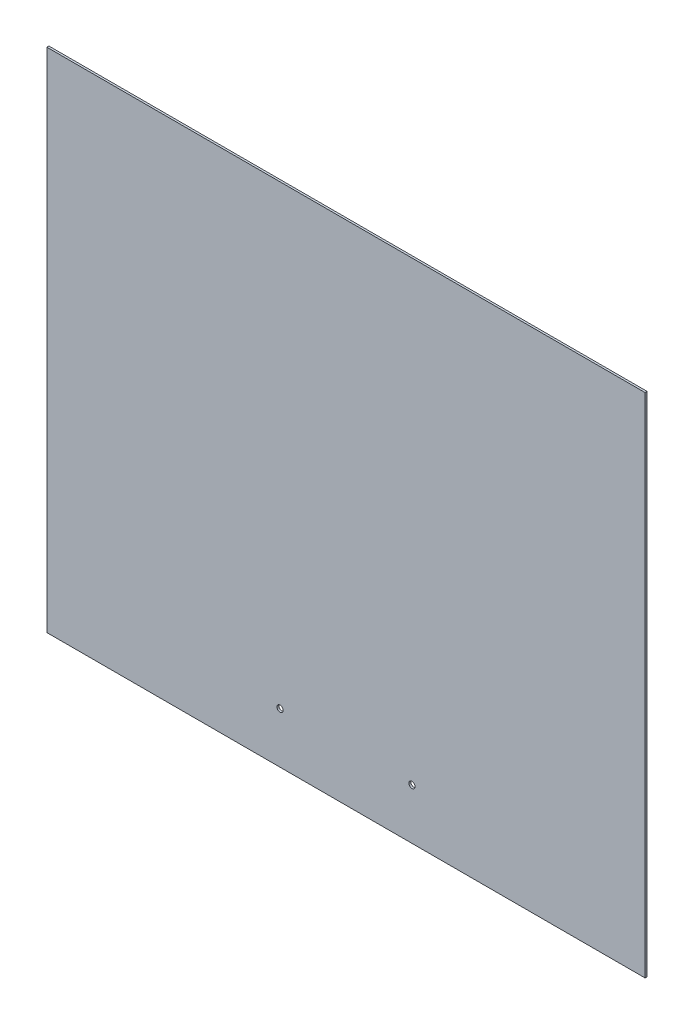
ISO-10303-21;
HEADER;
FILE_DESCRIPTION(('STEP AP214'),'2;1');
FILE_NAME('part.step','',(''),(''),'','','');
FILE_SCHEMA(('AUTOMOTIVE_DESIGN { 1 0 10303 214 1 1 1 1 }'));
ENDSEC;
DATA;
#1=APPLICATION_CONTEXT('core data for automotive mechanical design processes');
#2=APPLICATION_PROTOCOL_DEFINITION('international standard','automotive_design',2000,#1);
#3=PRODUCT_CONTEXT('',#1,'mechanical');
#4=PRODUCT('Part','Part','',(#3));
#5=PRODUCT_RELATED_PRODUCT_CATEGORY('part','',(#4));
#6=PRODUCT_DEFINITION_FORMATION('','',#4);
#7=PRODUCT_DEFINITION_CONTEXT('part definition',#1,'design');
#8=PRODUCT_DEFINITION('design','',#6,#7);
#9=PRODUCT_DEFINITION_SHAPE('','',#8);
#10=(LENGTH_UNIT() NAMED_UNIT(*) SI_UNIT(.MILLI.,.METRE.));
#11=(NAMED_UNIT(*) PLANE_ANGLE_UNIT() SI_UNIT($,.RADIAN.));
#12=(NAMED_UNIT(*) SI_UNIT($,.STERADIAN.) SOLID_ANGLE_UNIT());
#13=UNCERTAINTY_MEASURE_WITH_UNIT(LENGTH_MEASURE(1.E-05),#10,'distance_accuracy_value','');
#14=(GEOMETRIC_REPRESENTATION_CONTEXT(3) GLOBAL_UNCERTAINTY_ASSIGNED_CONTEXT((#13)) GLOBAL_UNIT_ASSIGNED_CONTEXT((#10,
#11,#12)) REPRESENTATION_CONTEXT('',''));
#15=CARTESIAN_POINT('',(0.,0.,0.));
#16=DIRECTION('',(0.,0.,1.));
#17=DIRECTION('',(1.,0.,0.));
#18=AXIS2_PLACEMENT_3D('',#15,#16,#17);
#19=CARTESIAN_POINT('',(0.,0.,2.));
#20=DIRECTION('',(1.,0.,0.));
#21=DIRECTION('',(0.,1.,0.));
#22=AXIS2_PLACEMENT_3D('',#19,#20,#21);
#23=PLANE('',#22);
#24=DIRECTION('',(0.,-1.,0.));
#25=VECTOR('',#24,1.);
#26=CARTESIAN_POINT('',(0.,0.,0.));
#27=LINE('',#26,#25);
#28=CARTESIAN_POINT('',(0.,0.,0.));
#29=VERTEX_POINT('',#28);
#30=CARTESIAN_POINT('',(0.,-500.,0.));
#31=VERTEX_POINT('',#30);
#32=EDGE_CURVE('E100',#29,#31,#27,.T.);
#33=ORIENTED_EDGE('',*,*,#32,.T.);
#34=DIRECTION('',(0.,0.,-1.));
#35=VECTOR('',#34,1.);
#36=CARTESIAN_POINT('',(0.,-500.,2.));
#37=LINE('',#36,#35);
#38=CARTESIAN_POINT('',(0.,-500.,2.));
#39=VERTEX_POINT('',#38);
#40=EDGE_CURVE('E11',#39,#31,#37,.T.);
#41=ORIENTED_EDGE('',*,*,#40,.F.);
#42=DIRECTION('',(0.,-1.,0.));
#43=VECTOR('',#42,1.);
#44=CARTESIAN_POINT('',(0.,0.,2.));
#45=LINE('',#44,#43);
#46=CARTESIAN_POINT('',(0.,0.,2.));
#47=VERTEX_POINT('',#46);
#48=EDGE_CURVE('E88',#47,#39,#45,.T.);
#49=ORIENTED_EDGE('',*,*,#48,.F.);
#50=DIRECTION('',(0.,0.,-1.));
#51=VECTOR('',#50,1.);
#52=CARTESIAN_POINT('',(0.,0.,2.));
#53=LINE('',#52,#51);
#54=EDGE_CURVE('E96',#47,#29,#53,.T.);
#55=ORIENTED_EDGE('',*,*,#54,.T.);
#56=EDGE_LOOP('',(#33,#41,#49,#55));
#57=FACE_BOUND('',#56,.T.);
#58=ADVANCED_FACE('F37',(#57),#23,.F.);
#59=CARTESIAN_POINT('',(0.,-500.,2.));
#60=DIRECTION('',(0.,1.,0.));
#61=DIRECTION('',(0.,0.,1.));
#62=AXIS2_PLACEMENT_3D('',#59,#60,#61);
#63=PLANE('',#62);
#64=DIRECTION('',(1.,0.,0.));
#65=VECTOR('',#64,1.);
#66=CARTESIAN_POINT('',(0.,-500.,0.));
#67=LINE('',#66,#65);
#68=CARTESIAN_POINT('',(590.,-500.,0.));
#69=VERTEX_POINT('',#68);
#70=EDGE_CURVE('E92',#31,#69,#67,.T.);
#71=ORIENTED_EDGE('',*,*,#70,.T.);
#72=DIRECTION('',(0.,0.,-1.));
#73=VECTOR('',#72,1.);
#74=CARTESIAN_POINT('',(590.,-500.,2.));
#75=LINE('',#74,#73);
#76=CARTESIAN_POINT('',(590.,-500.,2.));
#77=VERTEX_POINT('',#76);
#78=EDGE_CURVE('E45',#77,#69,#75,.T.);
#79=ORIENTED_EDGE('',*,*,#78,.F.);
#80=DIRECTION('',(1.,0.,0.));
#81=VECTOR('',#80,1.);
#82=CARTESIAN_POINT('',(0.,-500.,2.));
#83=LINE('',#82,#81);
#84=EDGE_CURVE('E83',#39,#77,#83,.T.);
#85=ORIENTED_EDGE('',*,*,#84,.F.);
#86=ORIENTED_EDGE('',*,*,#40,.T.);
#87=EDGE_LOOP('',(#71,#79,#85,#86));
#88=FACE_BOUND('',#87,.T.);
#89=ADVANCED_FACE('F91',(#88),#63,.F.);
#90=CARTESIAN_POINT('',(590.,0.,2.));
#91=DIRECTION('',(-1.,0.,0.));
#92=DIRECTION('',(0.,-1.,0.));
#93=AXIS2_PLACEMENT_3D('',#90,#91,#92);
#94=PLANE('',#93);
#95=DIRECTION('',(0.,1.,0.));
#96=VECTOR('',#95,1.);
#97=CARTESIAN_POINT('',(590.,0.,0.));
#98=LINE('',#97,#96);
#99=CARTESIAN_POINT('',(590.,0.,0.));
#100=VERTEX_POINT('',#99);
#101=EDGE_CURVE('E70',#69,#100,#98,.T.);
#102=ORIENTED_EDGE('',*,*,#101,.T.);
#103=DIRECTION('',(0.,0.,-1.));
#104=VECTOR('',#103,1.);
#105=CARTESIAN_POINT('',(590.,0.,2.));
#106=LINE('',#105,#104);
#107=CARTESIAN_POINT('',(590.,0.,2.));
#108=VERTEX_POINT('',#107);
#109=EDGE_CURVE('E93',#108,#100,#106,.T.);
#110=ORIENTED_EDGE('',*,*,#109,.F.);
#111=DIRECTION('',(0.,1.,0.));
#112=VECTOR('',#111,1.);
#113=CARTESIAN_POINT('',(590.,0.,2.));
#114=LINE('',#113,#112);
#115=EDGE_CURVE('E86',#77,#108,#114,.T.);
#116=ORIENTED_EDGE('',*,*,#115,.F.);
#117=ORIENTED_EDGE('',*,*,#78,.T.);
#118=EDGE_LOOP('',(#102,#110,#116,#117));
#119=FACE_BOUND('',#118,.T.);
#120=ADVANCED_FACE('F94',(#119),#94,.F.);
#121=CARTESIAN_POINT('',(0.,0.,2.));
#122=DIRECTION('',(0.,-1.,0.));
#123=DIRECTION('',(0.,0.,-1.));
#124=AXIS2_PLACEMENT_3D('',#121,#122,#123);
#125=PLANE('',#124);
#126=DIRECTION('',(-1.,0.,0.));
#127=VECTOR('',#126,1.);
#128=CARTESIAN_POINT('',(0.,0.,0.));
#129=LINE('',#128,#127);
#130=EDGE_CURVE('E76',#100,#29,#129,.T.);
#131=ORIENTED_EDGE('',*,*,#130,.T.);
#132=ORIENTED_EDGE('',*,*,#54,.F.);
#133=DIRECTION('',(-1.,0.,0.));
#134=VECTOR('',#133,1.);
#135=CARTESIAN_POINT('',(0.,0.,2.));
#136=LINE('',#135,#134);
#137=EDGE_CURVE('E53',#108,#47,#136,.T.);
#138=ORIENTED_EDGE('',*,*,#137,.F.);
#139=ORIENTED_EDGE('',*,*,#109,.T.);
#140=EDGE_LOOP('',(#131,#132,#138,#139));
#141=FACE_BOUND('',#140,.T.);
#142=ADVANCED_FACE('F108',(#141),#125,.F.);
#143=CARTESIAN_POINT('',(0.,0.,2.));
#144=DIRECTION('',(0.,0.,1.));
#145=DIRECTION('',(1.,0.,0.));
#146=AXIS2_PLACEMENT_3D('',#143,#144,#145);
#147=PLANE('',#146);
#148=CARTESIAN_POINT('',(230.,-450.,2.));
#149=DIRECTION('',(0.,0.,1.));
#150=DIRECTION('',(1.,0.,0.));
#151=AXIS2_PLACEMENT_3D('',#148,#149,#150);
#152=CIRCLE('',#151,3.09999999999999);
#153=CARTESIAN_POINT('',(233.1,-450.,2.));
#154=VERTEX_POINT('',#153);
#155=EDGE_CURVE('E120',#154,#154,#152,.T.);
#156=ORIENTED_EDGE('',*,*,#155,.F.);
#157=EDGE_LOOP('',(#156));
#158=FACE_BOUND('',#157,.T.);
#159=CARTESIAN_POINT('',(360.,-450.,2.));
#160=DIRECTION('',(0.,0.,1.));
#161=DIRECTION('',(1.,0.,0.));
#162=AXIS2_PLACEMENT_3D('',#159,#160,#161);
#163=CIRCLE('',#162,3.09999999999999);
#164=CARTESIAN_POINT('',(363.1,-450.,2.));
#165=VERTEX_POINT('',#164);
#166=EDGE_CURVE('E117',#165,#165,#163,.T.);
#167=ORIENTED_EDGE('',*,*,#166,.F.);
#168=EDGE_LOOP('',(#167));
#169=FACE_BOUND('',#168,.T.);
#170=ORIENTED_EDGE('',*,*,#48,.T.);
#171=ORIENTED_EDGE('',*,*,#84,.T.);
#172=ORIENTED_EDGE('',*,*,#115,.T.);
#173=ORIENTED_EDGE('',*,*,#137,.T.);
#174=EDGE_LOOP('',(#170,#171,#172,#173));
#175=FACE_BOUND('',#174,.T.);
#176=ADVANCED_FACE('F84',(#158,#169,#175),#147,.T.);
#177=CARTESIAN_POINT('',(0.,0.,0.));
#178=DIRECTION('',(0.,0.,1.));
#179=DIRECTION('',(1.,0.,0.));
#180=AXIS2_PLACEMENT_3D('',#177,#178,#179);
#181=PLANE('',#180);
#182=CARTESIAN_POINT('',(230.,-450.,0.));
#183=DIRECTION('',(0.,0.,1.));
#184=DIRECTION('',(1.,0.,0.));
#185=AXIS2_PLACEMENT_3D('',#182,#183,#184);
#186=CIRCLE('',#185,3.09999999999999);
#187=CARTESIAN_POINT('',(233.1,-450.,0.));
#188=VERTEX_POINT('',#187);
#189=EDGE_CURVE('E103',#188,#188,#186,.T.);
#190=ORIENTED_EDGE('',*,*,#189,.T.);
#191=EDGE_LOOP('',(#190));
#192=FACE_BOUND('',#191,.T.);
#193=CARTESIAN_POINT('',(360.,-450.,0.));
#194=DIRECTION('',(0.,0.,1.));
#195=DIRECTION('',(1.,0.,0.));
#196=AXIS2_PLACEMENT_3D('',#193,#194,#195);
#197=CIRCLE('',#196,3.09999999999999);
#198=CARTESIAN_POINT('',(363.1,-450.,0.));
#199=VERTEX_POINT('',#198);
#200=EDGE_CURVE('E114',#199,#199,#197,.T.);
#201=ORIENTED_EDGE('',*,*,#200,.T.);
#202=EDGE_LOOP('',(#201));
#203=FACE_BOUND('',#202,.T.);
#204=ORIENTED_EDGE('',*,*,#32,.F.);
#205=ORIENTED_EDGE('',*,*,#130,.F.);
#206=ORIENTED_EDGE('',*,*,#101,.F.);
#207=ORIENTED_EDGE('',*,*,#70,.F.);
#208=EDGE_LOOP('',(#204,#205,#206,#207));
#209=FACE_BOUND('',#208,.T.);
#210=ADVANCED_FACE('F111',(#192,#203,#209),#181,.F.);
#211=CARTESIAN_POINT('',(360.,-450.,0.));
#212=DIRECTION('',(0.,0.,1.));
#213=DIRECTION('',(1.,0.,0.));
#214=AXIS2_PLACEMENT_3D('',#211,#212,#213);
#215=CYLINDRICAL_SURFACE('',#214,3.09999999999999);
#216=ORIENTED_EDGE('',*,*,#200,.F.);
#217=EDGE_LOOP('',(#216));
#218=FACE_BOUND('',#217,.T.);
#219=ORIENTED_EDGE('',*,*,#166,.T.);
#220=EDGE_LOOP('',(#219));
#221=FACE_BOUND('',#220,.T.);
#222=ADVANCED_FACE('F131',(#218,#221),#215,.F.);
#223=CARTESIAN_POINT('',(230.,-450.,0.));
#224=DIRECTION('',(0.,0.,1.));
#225=DIRECTION('',(1.,0.,0.));
#226=AXIS2_PLACEMENT_3D('',#223,#224,#225);
#227=CYLINDRICAL_SURFACE('',#226,3.09999999999999);
#228=ORIENTED_EDGE('',*,*,#189,.F.);
#229=EDGE_LOOP('',(#228));
#230=FACE_BOUND('',#229,.T.);
#231=ORIENTED_EDGE('',*,*,#155,.T.);
#232=EDGE_LOOP('',(#231));
#233=FACE_BOUND('',#232,.T.);
#234=ADVANCED_FACE('F128',(#230,#233),#227,.F.);
#235=CLOSED_SHELL('',(#58,#89,#120,#142,#176,#210,#222,#234));
#236=MANIFOLD_SOLID_BREP('B2',#235);
#237=ADVANCED_BREP_SHAPE_REPRESENTATION('',(#18,#236),#14);
#238=SHAPE_DEFINITION_REPRESENTATION(#9,#237);
ENDSEC;
END-ISO-10303-21;
